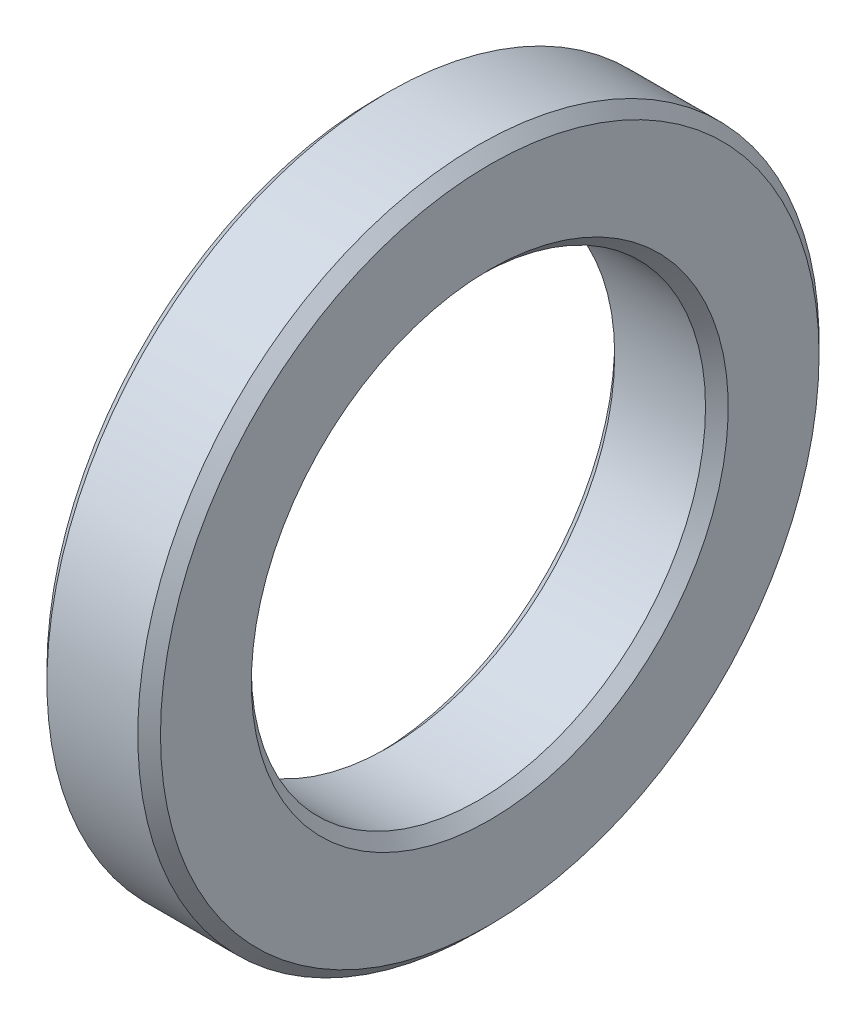
ISO-10303-21;
HEADER;
FILE_DESCRIPTION(('STEP AP214'),'2;1');
FILE_NAME('part.step','',(''),(''),'','','');
FILE_SCHEMA(('AUTOMOTIVE_DESIGN { 1 0 10303 214 1 1 1 1 }'));
ENDSEC;
DATA;
#1=APPLICATION_CONTEXT('core data for automotive mechanical design processes');
#2=APPLICATION_PROTOCOL_DEFINITION('international standard','automotive_design',2000,#1);
#3=PRODUCT_CONTEXT('',#1,'mechanical');
#4=PRODUCT('Part','Part','',(#3));
#5=PRODUCT_RELATED_PRODUCT_CATEGORY('part','',(#4));
#6=PRODUCT_DEFINITION_FORMATION('','',#4);
#7=PRODUCT_DEFINITION_CONTEXT('part definition',#1,'design');
#8=PRODUCT_DEFINITION('design','',#6,#7);
#9=PRODUCT_DEFINITION_SHAPE('','',#8);
#10=(LENGTH_UNIT() NAMED_UNIT(*) SI_UNIT(.MILLI.,.METRE.));
#11=(NAMED_UNIT(*) PLANE_ANGLE_UNIT() SI_UNIT($,.RADIAN.));
#12=(NAMED_UNIT(*) SI_UNIT($,.STERADIAN.) SOLID_ANGLE_UNIT());
#13=UNCERTAINTY_MEASURE_WITH_UNIT(LENGTH_MEASURE(1.E-05),#10,'distance_accuracy_value','');
#14=(GEOMETRIC_REPRESENTATION_CONTEXT(3) GLOBAL_UNCERTAINTY_ASSIGNED_CONTEXT((#13)) GLOBAL_UNIT_ASSIGNED_CONTEXT((#10,
#11,#12)) REPRESENTATION_CONTEXT('',''));
#15=CARTESIAN_POINT('',(0.,0.,0.));
#16=DIRECTION('',(0.,0.,1.));
#17=DIRECTION('',(1.,0.,0.));
#18=AXIS2_PLACEMENT_3D('',#15,#16,#17);
#19=CARTESIAN_POINT('',(-3.,0.,0.));
#20=DIRECTION('',(-1.,0.,0.));
#21=DIRECTION('',(0.,-1.,0.));
#22=AXIS2_PLACEMENT_3D('',#19,#20,#21);
#23=CYLINDRICAL_SURFACE('',#22,10.);
#24=CARTESIAN_POINT('',(4.5,0.,0.));
#25=DIRECTION('',(-1.,0.,0.));
#26=DIRECTION('',(0.,-1.,0.));
#27=AXIS2_PLACEMENT_3D('',#24,#25,#26);
#28=CIRCLE('',#27,10.);
#29=CARTESIAN_POINT('',(4.5,-10.,0.));
#30=VERTEX_POINT('',#29);
#31=EDGE_CURVE('E11',#30,#30,#28,.T.);
#32=ORIENTED_EDGE('',*,*,#31,.F.);
#33=EDGE_LOOP('',(#32));
#34=FACE_BOUND('',#33,.T.);
#35=CARTESIAN_POINT('',(0.5,0.,0.));
#36=DIRECTION('',(-1.,0.,0.));
#37=DIRECTION('',(0.,-1.,0.));
#38=AXIS2_PLACEMENT_3D('',#35,#36,#37);
#39=CIRCLE('',#38,10.);
#40=CARTESIAN_POINT('',(0.5,-10.,0.));
#41=VERTEX_POINT('',#40);
#42=EDGE_CURVE('E70',#41,#41,#39,.T.);
#43=ORIENTED_EDGE('',*,*,#42,.T.);
#44=EDGE_LOOP('',(#43));
#45=FACE_BOUND('',#44,.T.);
#46=ADVANCED_FACE('F16',(#34,#45),#23,.F.);
#47=CARTESIAN_POINT('',(5.,0.,0.));
#48=DIRECTION('',(1.,0.,0.));
#49=DIRECTION('',(0.,1.,0.));
#50=AXIS2_PLACEMENT_3D('',#47,#48,#49);
#51=CONICAL_SURFACE('',#50,10.5,0.785398163397449);
#52=CARTESIAN_POINT('',(5.,0.,0.));
#53=DIRECTION('',(-1.,0.,0.));
#54=DIRECTION('',(0.,-1.,0.));
#55=AXIS2_PLACEMENT_3D('',#52,#53,#54);
#56=CIRCLE('',#55,10.5);
#57=CARTESIAN_POINT('',(5.,-10.5,0.));
#58=VERTEX_POINT('',#57);
#59=EDGE_CURVE('E19',#58,#58,#56,.T.);
#60=ORIENTED_EDGE('',*,*,#59,.F.);
#61=EDGE_LOOP('',(#60));
#62=FACE_BOUND('',#61,.T.);
#63=ORIENTED_EDGE('',*,*,#31,.T.);
#64=EDGE_LOOP('',(#63));
#65=FACE_BOUND('',#64,.T.);
#66=ADVANCED_FACE('F102',(#62,#65),#51,.F.);
#67=CARTESIAN_POINT('',(5.,-14.5,0.));
#68=DIRECTION('',(1.,0.,0.));
#69=DIRECTION('',(0.,1.,0.));
#70=AXIS2_PLACEMENT_3D('',#67,#68,#69);
#71=PLANE('',#70);
#72=CARTESIAN_POINT('',(5.,0.,0.));
#73=DIRECTION('',(-1.,0.,0.));
#74=DIRECTION('',(0.,-1.,0.));
#75=AXIS2_PLACEMENT_3D('',#72,#73,#74);
#76=CIRCLE('',#75,14.5);
#77=CARTESIAN_POINT('',(5.,-14.5,0.));
#78=VERTEX_POINT('',#77);
#79=EDGE_CURVE('E79',#78,#78,#76,.T.);
#80=ORIENTED_EDGE('',*,*,#79,.F.);
#81=EDGE_LOOP('',(#80));
#82=FACE_BOUND('',#81,.T.);
#83=ORIENTED_EDGE('',*,*,#59,.T.);
#84=EDGE_LOOP('',(#83));
#85=FACE_BOUND('',#84,.T.);
#86=ADVANCED_FACE('F97',(#82,#85),#71,.T.);
#87=CARTESIAN_POINT('',(4.5,0.,0.));
#88=DIRECTION('',(-1.,0.,0.));
#89=DIRECTION('',(0.,-1.,0.));
#90=AXIS2_PLACEMENT_3D('',#87,#88,#89);
#91=CONICAL_SURFACE('',#90,15.,0.785398163397448);
#92=CARTESIAN_POINT('',(4.5,0.,0.));
#93=DIRECTION('',(-1.,0.,0.));
#94=DIRECTION('',(0.,-1.,0.));
#95=AXIS2_PLACEMENT_3D('',#92,#93,#94);
#96=CIRCLE('',#95,15.);
#97=CARTESIAN_POINT('',(4.5,-15.,0.));
#98=VERTEX_POINT('',#97);
#99=EDGE_CURVE('E81',#98,#98,#96,.T.);
#100=ORIENTED_EDGE('',*,*,#99,.F.);
#101=EDGE_LOOP('',(#100));
#102=FACE_BOUND('',#101,.T.);
#103=ORIENTED_EDGE('',*,*,#79,.T.);
#104=EDGE_LOOP('',(#103));
#105=FACE_BOUND('',#104,.T.);
#106=ADVANCED_FACE('F94',(#102,#105),#91,.T.);
#107=CARTESIAN_POINT('',(-3.,0.,0.));
#108=DIRECTION('',(-1.,0.,0.));
#109=DIRECTION('',(0.,-1.,0.));
#110=AXIS2_PLACEMENT_3D('',#107,#108,#109);
#111=CYLINDRICAL_SURFACE('',#110,15.);
#112=CARTESIAN_POINT('',(0.5,0.,0.));
#113=DIRECTION('',(-1.,0.,0.));
#114=DIRECTION('',(0.,-1.,0.));
#115=AXIS2_PLACEMENT_3D('',#112,#113,#114);
#116=CIRCLE('',#115,15.);
#117=CARTESIAN_POINT('',(0.5,-15.,0.));
#118=VERTEX_POINT('',#117);
#119=EDGE_CURVE('E83',#118,#118,#116,.T.);
#120=ORIENTED_EDGE('',*,*,#119,.F.);
#121=EDGE_LOOP('',(#120));
#122=FACE_BOUND('',#121,.T.);
#123=ORIENTED_EDGE('',*,*,#99,.T.);
#124=EDGE_LOOP('',(#123));
#125=FACE_BOUND('',#124,.T.);
#126=ADVANCED_FACE('F92',(#122,#125),#111,.T.);
#127=CARTESIAN_POINT('',(0.,0.,0.));
#128=DIRECTION('',(1.,0.,0.));
#129=DIRECTION('',(0.,1.,0.));
#130=AXIS2_PLACEMENT_3D('',#127,#128,#129);
#131=CONICAL_SURFACE('',#130,14.5,0.785398163397447);
#132=CARTESIAN_POINT('',(0.,0.,0.));
#133=DIRECTION('',(-1.,0.,0.));
#134=DIRECTION('',(0.,-1.,0.));
#135=AXIS2_PLACEMENT_3D('',#132,#133,#134);
#136=CIRCLE('',#135,14.5);
#137=CARTESIAN_POINT('',(0.,-14.5,0.));
#138=VERTEX_POINT('',#137);
#139=EDGE_CURVE('E76',#138,#138,#136,.T.);
#140=ORIENTED_EDGE('',*,*,#139,.F.);
#141=EDGE_LOOP('',(#140));
#142=FACE_BOUND('',#141,.T.);
#143=ORIENTED_EDGE('',*,*,#119,.T.);
#144=EDGE_LOOP('',(#143));
#145=FACE_BOUND('',#144,.T.);
#146=ADVANCED_FACE('F122',(#142,#145),#131,.T.);
#147=CARTESIAN_POINT('',(0.,-10.5,0.));
#148=DIRECTION('',(-1.,0.,0.));
#149=DIRECTION('',(0.,1.,0.));
#150=AXIS2_PLACEMENT_3D('',#147,#148,#149);
#151=PLANE('',#150);
#152=CARTESIAN_POINT('',(0.,0.,0.));
#153=DIRECTION('',(-1.,0.,0.));
#154=DIRECTION('',(0.,-1.,0.));
#155=AXIS2_PLACEMENT_3D('',#152,#153,#154);
#156=CIRCLE('',#155,10.5);
#157=CARTESIAN_POINT('',(0.,-10.5,0.));
#158=VERTEX_POINT('',#157);
#159=EDGE_CURVE('E66',#158,#158,#156,.T.);
#160=ORIENTED_EDGE('',*,*,#159,.F.);
#161=EDGE_LOOP('',(#160));
#162=FACE_BOUND('',#161,.T.);
#163=ORIENTED_EDGE('',*,*,#139,.T.);
#164=EDGE_LOOP('',(#163));
#165=FACE_BOUND('',#164,.T.);
#166=ADVANCED_FACE('F117',(#162,#165),#151,.T.);
#167=CARTESIAN_POINT('',(0.5,0.,0.));
#168=DIRECTION('',(-1.,0.,0.));
#169=DIRECTION('',(0.,-1.,0.));
#170=AXIS2_PLACEMENT_3D('',#167,#168,#169);
#171=CONICAL_SURFACE('',#170,10.,0.785398163397448);
#172=ORIENTED_EDGE('',*,*,#42,.F.);
#173=EDGE_LOOP('',(#172));
#174=FACE_BOUND('',#173,.T.);
#175=ORIENTED_EDGE('',*,*,#159,.T.);
#176=EDGE_LOOP('',(#175));
#177=FACE_BOUND('',#176,.T.);
#178=ADVANCED_FACE('F67',(#174,#177),#171,.F.);
#179=CLOSED_SHELL('',(#46,#66,#86,#106,#126,#146,#166,#178));
#180=MANIFOLD_SOLID_BREP('B1',#179);
#181=ADVANCED_BREP_SHAPE_REPRESENTATION('',(#18,#180),#14);
#182=SHAPE_DEFINITION_REPRESENTATION(#9,#181);
ENDSEC;
END-ISO-10303-21;
